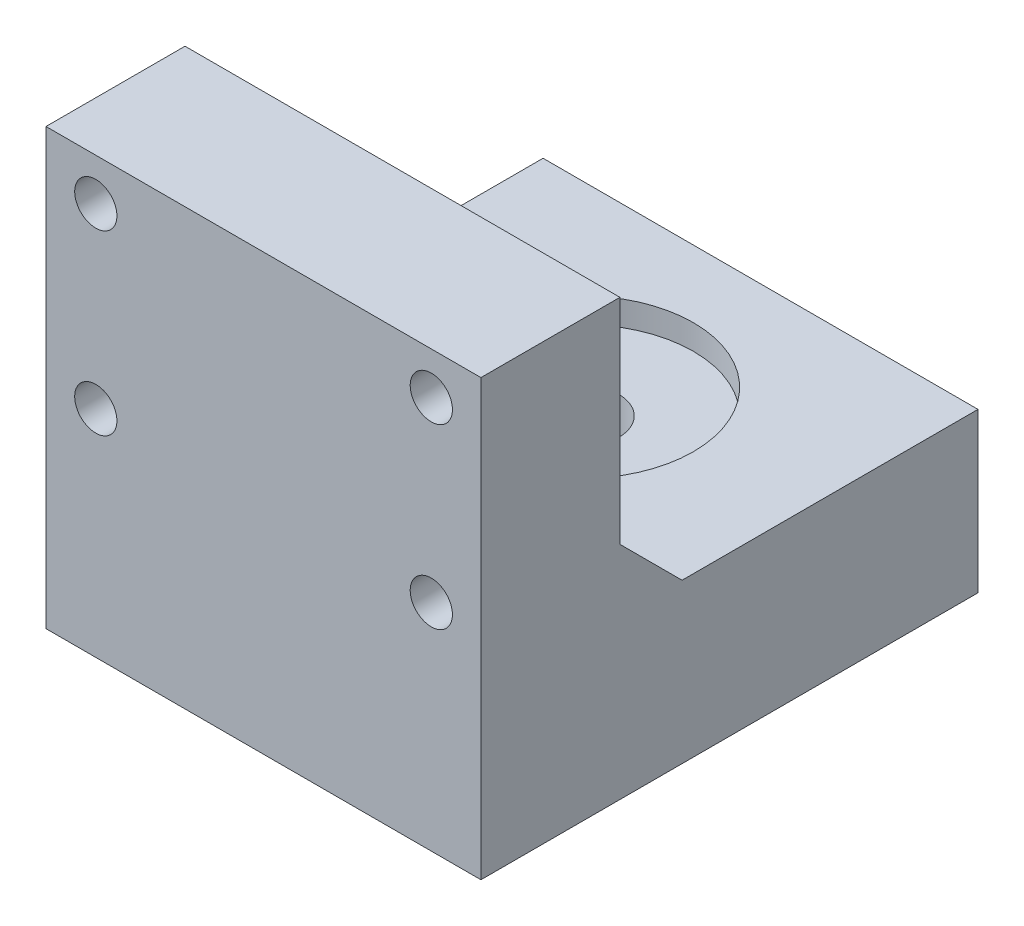
ISO-10303-21;
HEADER;
FILE_DESCRIPTION(('STEP AP214'),'2;1');
FILE_NAME('part.step','',(''),(''),'','','');
FILE_SCHEMA(('AUTOMOTIVE_DESIGN { 1 0 10303 214 1 1 1 1 }'));
ENDSEC;
DATA;
#1=APPLICATION_CONTEXT('core data for automotive mechanical design processes');
#2=APPLICATION_PROTOCOL_DEFINITION('international standard','automotive_design',2000,#1);
#3=PRODUCT_CONTEXT('',#1,'mechanical');
#4=PRODUCT('Part','Part','',(#3));
#5=PRODUCT_RELATED_PRODUCT_CATEGORY('part','',(#4));
#6=PRODUCT_DEFINITION_FORMATION('','',#4);
#7=PRODUCT_DEFINITION_CONTEXT('part definition',#1,'design');
#8=PRODUCT_DEFINITION('design','',#6,#7);
#9=PRODUCT_DEFINITION_SHAPE('','',#8);
#10=(LENGTH_UNIT() NAMED_UNIT(*) SI_UNIT(.MILLI.,.METRE.));
#11=(NAMED_UNIT(*) PLANE_ANGLE_UNIT() SI_UNIT($,.RADIAN.));
#12=(NAMED_UNIT(*) SI_UNIT($,.STERADIAN.) SOLID_ANGLE_UNIT());
#13=UNCERTAINTY_MEASURE_WITH_UNIT(LENGTH_MEASURE(1.E-05),#10,'distance_accuracy_value','');
#14=(GEOMETRIC_REPRESENTATION_CONTEXT(3) GLOBAL_UNCERTAINTY_ASSIGNED_CONTEXT((#13)) GLOBAL_UNIT_ASSIGNED_CONTEXT((#10,
#11,#12)) REPRESENTATION_CONTEXT('',''));
#15=CARTESIAN_POINT('',(0.,0.,0.));
#16=DIRECTION('',(0.,0.,1.));
#17=DIRECTION('',(1.,0.,0.));
#18=AXIS2_PLACEMENT_3D('',#15,#16,#17);
#19=CARTESIAN_POINT('',(17.5,0.,-25.5934447104071));
#20=DIRECTION('',(0.,1.,0.));
#21=DIRECTION('',(0.,0.,1.));
#22=AXIS2_PLACEMENT_3D('',#19,#20,#21);
#23=CYLINDRICAL_SURFACE('',#22,3.0015);
#24=CARTESIAN_POINT('',(17.5,0.,-25.5934447104071));
#25=DIRECTION('',(0.,1.,0.));
#26=DIRECTION('',(0.,0.,1.));
#27=AXIS2_PLACEMENT_3D('',#24,#25,#26);
#28=CIRCLE('',#27,3.0015);
#29=CARTESIAN_POINT('',(17.5,0.,-22.5919447104071));
#30=VERTEX_POINT('',#29);
#31=EDGE_CURVE('E168',#30,#30,#28,.T.);
#32=ORIENTED_EDGE('',*,*,#31,.F.);
#33=EDGE_LOOP('',(#32));
#34=FACE_BOUND('',#33,.T.);
#35=CARTESIAN_POINT('',(17.5,10.7850164809302,-25.5934447104071));
#36=DIRECTION('',(0.,1.,0.));
#37=DIRECTION('',(0.,0.,1.));
#38=AXIS2_PLACEMENT_3D('',#35,#36,#37);
#39=CIRCLE('',#38,3.0015);
#40=CARTESIAN_POINT('',(17.5,10.7850164809302,-22.5919447104071));
#41=VERTEX_POINT('',#40);
#42=EDGE_CURVE('E165',#41,#41,#39,.F.);
#43=ORIENTED_EDGE('',*,*,#42,.F.);
#44=EDGE_LOOP('',(#43));
#45=FACE_BOUND('',#44,.T.);
#46=ADVANCED_FACE('F51',(#34,#45),#23,.F.);
#47=CARTESIAN_POINT('',(35.,35.,-1.04584836647184E-13));
#48=DIRECTION('',(0.,-1.,0.));
#49=DIRECTION('',(0.,0.,-1.));
#50=AXIS2_PLACEMENT_3D('',#47,#48,#49);
#51=PLANE('',#50);
#52=DIRECTION('',(0.,0.,1.));
#53=VECTOR('',#52,1.);
#54=CARTESIAN_POINT('',(0.,35.,-1.04584836647184E-13));
#55=LINE('',#54,#53);
#56=CARTESIAN_POINT('',(0.,35.,-11.1868894208141));
#57=VERTEX_POINT('',#56);
#58=CARTESIAN_POINT('',(0.,35.,-1.04584836647184E-13));
#59=VERTEX_POINT('',#58);
#60=EDGE_CURVE('E151',#57,#59,#55,.T.);
#61=ORIENTED_EDGE('',*,*,#60,.T.);
#62=DIRECTION('',(-1.,0.,0.));
#63=VECTOR('',#62,1.);
#64=CARTESIAN_POINT('',(35.,35.,-1.04584836647184E-13));
#65=LINE('',#64,#63);
#66=CARTESIAN_POINT('',(35.,35.,-1.04584836647184E-13));
#67=VERTEX_POINT('',#66);
#68=EDGE_CURVE('E129',#67,#59,#65,.T.);
#69=ORIENTED_EDGE('',*,*,#68,.F.);
#70=DIRECTION('',(0.,0.,1.));
#71=VECTOR('',#70,1.);
#72=CARTESIAN_POINT('',(35.,35.,-1.04584836647184E-13));
#73=LINE('',#72,#71);
#74=CARTESIAN_POINT('',(35.,35.,-11.1868894208141));
#75=VERTEX_POINT('',#74);
#76=EDGE_CURVE('E137',#75,#67,#73,.T.);
#77=ORIENTED_EDGE('',*,*,#76,.F.);
#78=DIRECTION('',(-1.,0.,0.));
#79=VECTOR('',#78,1.);
#80=CARTESIAN_POINT('',(35.,35.,-11.1868894208141));
#81=LINE('',#80,#79);
#82=EDGE_CURVE('E212',#75,#57,#81,.T.);
#83=ORIENTED_EDGE('',*,*,#82,.T.);
#84=EDGE_LOOP('',(#61,#69,#77,#83));
#85=FACE_BOUND('',#84,.T.);
#86=ADVANCED_FACE('F149',(#85),#51,.F.);
#87=CARTESIAN_POINT('',(35.,35.,-1.04584836647184E-13));
#88=DIRECTION('',(0.,0.,-1.));
#89=DIRECTION('',(0.,1.,0.));
#90=AXIS2_PLACEMENT_3D('',#87,#88,#89);
#91=PLANE('',#90);
#92=CARTESIAN_POINT('',(4.00681868991724,31.6165014780038,0.));
#93=DIRECTION('',(0.,0.,-1.));
#94=DIRECTION('',(-1.,0.,0.));
#95=AXIS2_PLACEMENT_3D('',#92,#93,#94);
#96=CIRCLE('',#95,1.7);
#97=CARTESIAN_POINT('',(2.30681868991724,31.6165014780038,0.));
#98=VERTEX_POINT('',#97);
#99=EDGE_CURVE('E327',#98,#98,#96,.T.);
#100=ORIENTED_EDGE('',*,*,#99,.T.);
#101=EDGE_LOOP('',(#100));
#102=FACE_BOUND('',#101,.T.);
#103=CARTESIAN_POINT('',(4.00681868991724,17.332786674142,0.));
#104=DIRECTION('',(0.,0.,-1.));
#105=DIRECTION('',(-1.,0.,0.));
#106=AXIS2_PLACEMENT_3D('',#103,#104,#105);
#107=CIRCLE('',#106,1.7);
#108=CARTESIAN_POINT('',(2.30681868991724,17.332786674142,0.));
#109=VERTEX_POINT('',#108);
#110=EDGE_CURVE('E315',#109,#109,#107,.T.);
#111=ORIENTED_EDGE('',*,*,#110,.T.);
#112=EDGE_LOOP('',(#111));
#113=FACE_BOUND('',#112,.T.);
#114=CARTESIAN_POINT('',(31.0068186899172,17.332786674142,0.));
#115=DIRECTION('',(0.,0.,-1.));
#116=DIRECTION('',(-1.,0.,0.));
#117=AXIS2_PLACEMENT_3D('',#114,#115,#116);
#118=CIRCLE('',#117,1.7);
#119=CARTESIAN_POINT('',(29.3068186899172,17.332786674142,0.));
#120=VERTEX_POINT('',#119);
#121=EDGE_CURVE('E303',#120,#120,#118,.T.);
#122=ORIENTED_EDGE('',*,*,#121,.T.);
#123=EDGE_LOOP('',(#122));
#124=FACE_BOUND('',#123,.T.);
#125=CARTESIAN_POINT('',(31.0068186899172,31.6165014780038,0.));
#126=DIRECTION('',(0.,0.,-1.));
#127=DIRECTION('',(-1.,0.,0.));
#128=AXIS2_PLACEMENT_3D('',#125,#126,#127);
#129=CIRCLE('',#128,1.7);
#130=CARTESIAN_POINT('',(29.3068186899172,31.6165014780038,0.));
#131=VERTEX_POINT('',#130);
#132=EDGE_CURVE('E285',#131,#131,#129,.T.);
#133=ORIENTED_EDGE('',*,*,#132,.T.);
#134=EDGE_LOOP('',(#133));
#135=FACE_BOUND('',#134,.T.);
#136=DIRECTION('',(0.,-1.,0.));
#137=VECTOR('',#136,1.);
#138=CARTESIAN_POINT('',(0.,35.,-1.04584836647184E-13));
#139=LINE('',#138,#137);
#140=CARTESIAN_POINT('',(0.,0.,0.));
#141=VERTEX_POINT('',#140);
#142=EDGE_CURVE('E258',#59,#141,#139,.T.);
#143=ORIENTED_EDGE('',*,*,#142,.T.);
#144=DIRECTION('',(-1.,0.,0.));
#145=VECTOR('',#144,1.);
#146=CARTESIAN_POINT('',(35.,0.,0.));
#147=LINE('',#146,#145);
#148=CARTESIAN_POINT('',(35.,0.,0.));
#149=VERTEX_POINT('',#148);
#150=EDGE_CURVE('E132',#149,#141,#147,.T.);
#151=ORIENTED_EDGE('',*,*,#150,.F.);
#152=DIRECTION('',(0.,-1.,0.));
#153=VECTOR('',#152,1.);
#154=CARTESIAN_POINT('',(35.,35.,-1.04584836647184E-13));
#155=LINE('',#154,#153);
#156=EDGE_CURVE('E125',#67,#149,#155,.T.);
#157=ORIENTED_EDGE('',*,*,#156,.F.);
#158=ORIENTED_EDGE('',*,*,#68,.T.);
#159=EDGE_LOOP('',(#143,#151,#157,#158));
#160=FACE_BOUND('',#159,.T.);
#161=ADVANCED_FACE('F127',(#102,#113,#124,#135,#160),#91,.F.);
#162=CARTESIAN_POINT('',(35.,0.,0.));
#163=DIRECTION('',(0.,1.,0.));
#164=DIRECTION('',(0.,0.,1.));
#165=AXIS2_PLACEMENT_3D('',#162,#163,#164);
#166=PLANE('',#165);
#167=ORIENTED_EDGE('',*,*,#31,.T.);
#168=EDGE_LOOP('',(#167));
#169=FACE_BOUND('',#168,.T.);
#170=DIRECTION('',(0.,0.,-1.));
#171=VECTOR('',#170,1.);
#172=CARTESIAN_POINT('',(0.,0.,0.));
#173=LINE('',#172,#171);
#174=CARTESIAN_POINT('',(0.,0.,-40.));
#175=VERTEX_POINT('',#174);
#176=EDGE_CURVE('E253',#141,#175,#173,.T.);
#177=ORIENTED_EDGE('',*,*,#176,.T.);
#178=DIRECTION('',(-1.,0.,0.));
#179=VECTOR('',#178,1.);
#180=CARTESIAN_POINT('',(35.,0.,-40.));
#181=LINE('',#180,#179);
#182=CARTESIAN_POINT('',(35.,0.,-40.));
#183=VERTEX_POINT('',#182);
#184=EDGE_CURVE('E161',#183,#175,#181,.T.);
#185=ORIENTED_EDGE('',*,*,#184,.F.);
#186=DIRECTION('',(0.,0.,-1.));
#187=VECTOR('',#186,1.);
#188=CARTESIAN_POINT('',(35.,0.,0.));
#189=LINE('',#188,#187);
#190=EDGE_CURVE('E136',#149,#183,#189,.T.);
#191=ORIENTED_EDGE('',*,*,#190,.F.);
#192=ORIENTED_EDGE('',*,*,#150,.T.);
#193=EDGE_LOOP('',(#177,#185,#191,#192));
#194=FACE_BOUND('',#193,.T.);
#195=ADVANCED_FACE('F394',(#169,#194),#166,.F.);
#196=CARTESIAN_POINT('',(35.,12.7850164809302,-40.));
#197=DIRECTION('',(0.,0.,1.));
#198=DIRECTION('',(1.,0.,0.));
#199=AXIS2_PLACEMENT_3D('',#196,#197,#198);
#200=PLANE('',#199);
#201=DIRECTION('',(0.,1.,0.));
#202=VECTOR('',#201,1.);
#203=CARTESIAN_POINT('',(0.,12.7850164809302,-40.));
#204=LINE('',#203,#202);
#205=CARTESIAN_POINT('',(0.,12.7850164809302,-40.));
#206=VERTEX_POINT('',#205);
#207=EDGE_CURVE('E248',#175,#206,#204,.T.);
#208=ORIENTED_EDGE('',*,*,#207,.T.);
#209=DIRECTION('',(-1.,0.,0.));
#210=VECTOR('',#209,1.);
#211=CARTESIAN_POINT('',(35.,12.7850164809302,-40.));
#212=LINE('',#211,#210);
#213=CARTESIAN_POINT('',(35.,12.7850164809302,-40.));
#214=VERTEX_POINT('',#213);
#215=EDGE_CURVE('E207',#214,#206,#212,.T.);
#216=ORIENTED_EDGE('',*,*,#215,.F.);
#217=DIRECTION('',(0.,1.,0.));
#218=VECTOR('',#217,1.);
#219=CARTESIAN_POINT('',(35.,12.7850164809302,-40.));
#220=LINE('',#219,#218);
#221=EDGE_CURVE('E226',#183,#214,#220,.T.);
#222=ORIENTED_EDGE('',*,*,#221,.F.);
#223=ORIENTED_EDGE('',*,*,#184,.T.);
#224=EDGE_LOOP('',(#208,#216,#222,#223));
#225=FACE_BOUND('',#224,.T.);
#226=ADVANCED_FACE('F390',(#225),#200,.F.);
#227=CARTESIAN_POINT('',(35.,12.7850164809302,-11.1868894208141));
#228=DIRECTION('',(0.,-1.,0.));
#229=DIRECTION('',(0.,0.,-1.));
#230=AXIS2_PLACEMENT_3D('',#227,#228,#229);
#231=PLANE('',#230);
#232=CARTESIAN_POINT('',(17.5,12.7850164809302,-25.5934447104071));
#233=DIRECTION('',(0.,1.,0.));
#234=DIRECTION('',(0.,0.,1.));
#235=AXIS2_PLACEMENT_3D('',#232,#233,#234);
#236=CIRCLE('',#235,9.);
#237=CARTESIAN_POINT('',(17.5,12.7850164809302,-16.5934447104071));
#238=VERTEX_POINT('',#237);
#239=EDGE_CURVE('E279',#238,#238,#236,.T.);
#240=ORIENTED_EDGE('',*,*,#239,.F.);
#241=EDGE_LOOP('',(#240));
#242=FACE_BOUND('',#241,.T.);
#243=DIRECTION('',(0.,0.,1.));
#244=VECTOR('',#243,1.);
#245=CARTESIAN_POINT('',(0.,12.7850164809302,-11.1868894208141));
#246=LINE('',#245,#244);
#247=CARTESIAN_POINT('',(0.,12.7850164809302,-16.1868894208141));
#248=VERTEX_POINT('',#247);
#249=EDGE_CURVE('E243',#206,#248,#246,.T.);
#250=ORIENTED_EDGE('',*,*,#249,.T.);
#251=DIRECTION('',(1.,0.,0.));
#252=VECTOR('',#251,1.);
#253=CARTESIAN_POINT('',(35.,12.7850164809302,-16.1868894208141));
#254=LINE('',#253,#252);
#255=CARTESIAN_POINT('',(35.,12.7850164809302,-16.1868894208141));
#256=VERTEX_POINT('',#255);
#257=EDGE_CURVE('E68',#248,#256,#254,.T.);
#258=ORIENTED_EDGE('',*,*,#257,.T.);
#259=DIRECTION('',(0.,0.,1.));
#260=VECTOR('',#259,1.);
#261=CARTESIAN_POINT('',(35.,12.7850164809302,-11.1868894208141));
#262=LINE('',#261,#260);
#263=EDGE_CURVE('E221',#214,#256,#262,.T.);
#264=ORIENTED_EDGE('',*,*,#263,.F.);
#265=ORIENTED_EDGE('',*,*,#215,.T.);
#266=EDGE_LOOP('',(#250,#258,#264,#265));
#267=FACE_BOUND('',#266,.T.);
#268=ADVANCED_FACE('F348',(#242,#267),#231,.F.);
#269=CARTESIAN_POINT('',(35.,35.,-11.1868894208141));
#270=DIRECTION('',(0.,0.,1.));
#271=DIRECTION('',(1.,0.,0.));
#272=AXIS2_PLACEMENT_3D('',#269,#270,#271);
#273=PLANE('',#272);
#274=CARTESIAN_POINT('',(4.00681868991724,31.6165014780038,-11.1868894208141));
#275=DIRECTION('',(0.,0.,-1.));
#276=DIRECTION('',(-1.,0.,0.));
#277=AXIS2_PLACEMENT_3D('',#274,#275,#276);
#278=CIRCLE('',#277,1.7);
#279=CARTESIAN_POINT('',(2.30681868991724,31.6165014780038,-11.1868894208141));
#280=VERTEX_POINT('',#279);
#281=EDGE_CURVE('E321',#280,#280,#278,.T.);
#282=ORIENTED_EDGE('',*,*,#281,.F.);
#283=EDGE_LOOP('',(#282));
#284=FACE_BOUND('',#283,.T.);
#285=DIRECTION('',(0.,1.,0.));
#286=VECTOR('',#285,1.);
#287=CARTESIAN_POINT('',(35.,35.,-11.1868894208141));
#288=LINE('',#287,#286);
#289=CARTESIAN_POINT('',(35.,17.7850164809303,-11.1868894208141));
#290=VERTEX_POINT('',#289);
#291=EDGE_CURVE('E142',#290,#75,#288,.T.);
#292=ORIENTED_EDGE('',*,*,#291,.F.);
#293=DIRECTION('',(-1.,0.,0.));
#294=VECTOR('',#293,1.);
#295=CARTESIAN_POINT('',(0.,17.7850164809303,-11.1868894208141));
#296=LINE('',#295,#294);
#297=CARTESIAN_POINT('',(32.6455646134369,17.7850164809303,-11.1868894208141));
#298=VERTEX_POINT('',#297);
#299=EDGE_CURVE('E173',#290,#298,#296,.T.);
#300=ORIENTED_EDGE('',*,*,#299,.T.);
#301=CARTESIAN_POINT('',(31.0068186899172,17.332786674142,-11.1868894208141));
#302=DIRECTION('',(0.,0.,-1.));
#303=DIRECTION('',(-1.,0.,0.));
#304=AXIS2_PLACEMENT_3D('',#301,#302,#303);
#305=CIRCLE('',#304,1.7);
#306=CARTESIAN_POINT('',(29.3680727663976,17.7850164809303,-11.1868894208141));
#307=VERTEX_POINT('',#306);
#308=EDGE_CURVE('E297',#307,#298,#305,.T.);
#309=ORIENTED_EDGE('',*,*,#308,.F.);
#310=DIRECTION('',(-1.,0.,0.));
#311=VECTOR('',#310,1.);
#312=CARTESIAN_POINT('',(0.,17.7850164809303,-11.1868894208141));
#313=LINE('',#312,#311);
#314=CARTESIAN_POINT('',(5.64556461343688,17.7850164809303,-11.1868894208141));
#315=VERTEX_POINT('',#314);
#316=EDGE_CURVE('E159',#307,#315,#313,.T.);
#317=ORIENTED_EDGE('',*,*,#316,.T.);
#318=CARTESIAN_POINT('',(4.00681868991724,17.332786674142,-11.1868894208141));
#319=DIRECTION('',(0.,0.,-1.));
#320=DIRECTION('',(-1.,0.,0.));
#321=AXIS2_PLACEMENT_3D('',#318,#319,#320);
#322=CIRCLE('',#321,1.7);
#323=CARTESIAN_POINT('',(2.36807276639759,17.7850164809303,-11.1868894208141));
#324=VERTEX_POINT('',#323);
#325=EDGE_CURVE('E309',#324,#315,#322,.T.);
#326=ORIENTED_EDGE('',*,*,#325,.F.);
#327=DIRECTION('',(-1.,0.,0.));
#328=VECTOR('',#327,1.);
#329=CARTESIAN_POINT('',(0.,17.7850164809303,-11.1868894208141));
#330=LINE('',#329,#328);
#331=CARTESIAN_POINT('',(0.,17.7850164809303,-11.1868894208141));
#332=VERTEX_POINT('',#331);
#333=EDGE_CURVE('E153',#324,#332,#330,.T.);
#334=ORIENTED_EDGE('',*,*,#333,.T.);
#335=DIRECTION('',(0.,1.,0.));
#336=VECTOR('',#335,1.);
#337=CARTESIAN_POINT('',(0.,35.,-11.1868894208141));
#338=LINE('',#337,#336);
#339=EDGE_CURVE('E147',#332,#57,#338,.T.);
#340=ORIENTED_EDGE('',*,*,#339,.T.);
#341=ORIENTED_EDGE('',*,*,#82,.F.);
#342=EDGE_LOOP('',(#292,#300,#309,#317,#326,#334,#340,#341));
#343=FACE_BOUND('',#342,.T.);
#344=CARTESIAN_POINT('',(31.0068186899172,31.6165014780038,-11.1868894208141));
#345=DIRECTION('',(0.,0.,-1.));
#346=DIRECTION('',(-1.,0.,0.));
#347=AXIS2_PLACEMENT_3D('',#344,#345,#346);
#348=CIRCLE('',#347,1.7);
#349=CARTESIAN_POINT('',(29.3068186899172,31.6165014780038,-11.1868894208141));
#350=VERTEX_POINT('',#349);
#351=EDGE_CURVE('E291',#350,#350,#348,.T.);
#352=ORIENTED_EDGE('',*,*,#351,.F.);
#353=EDGE_LOOP('',(#352));
#354=FACE_BOUND('',#353,.T.);
#355=ADVANCED_FACE('F345',(#284,#343,#354),#273,.F.);
#356=CARTESIAN_POINT('',(35.,0.,0.));
#357=DIRECTION('',(-1.,0.,0.));
#358=DIRECTION('',(0.,0.,1.));
#359=AXIS2_PLACEMENT_3D('',#356,#357,#358);
#360=PLANE('',#359);
#361=ORIENTED_EDGE('',*,*,#76,.T.);
#362=ORIENTED_EDGE('',*,*,#156,.T.);
#363=ORIENTED_EDGE('',*,*,#190,.T.);
#364=ORIENTED_EDGE('',*,*,#221,.T.);
#365=ORIENTED_EDGE('',*,*,#263,.T.);
#366=DIRECTION('',(0.,-0.70710678118655,-0.707106781186545));
#367=VECTOR('',#366,1.);
#368=CARTESIAN_POINT('',(35.,14.4859529508721,-14.4859529508722));
#369=LINE('',#368,#367);
#370=EDGE_CURVE('E11',#256,#290,#369,.F.);
#371=ORIENTED_EDGE('',*,*,#370,.T.);
#372=ORIENTED_EDGE('',*,*,#291,.T.);
#373=EDGE_LOOP('',(#361,#362,#363,#364,#365,#371,#372));
#374=FACE_BOUND('',#373,.T.);
#375=ADVANCED_FACE('F140',(#374),#360,.F.);
#376=CARTESIAN_POINT('',(0.,0.,0.));
#377=DIRECTION('',(-1.,0.,0.));
#378=DIRECTION('',(0.,0.,1.));
#379=AXIS2_PLACEMENT_3D('',#376,#377,#378);
#380=PLANE('',#379);
#381=ORIENTED_EDGE('',*,*,#60,.F.);
#382=ORIENTED_EDGE('',*,*,#339,.F.);
#383=DIRECTION('',(0.,0.70710678118655,0.707106781186545));
#384=VECTOR('',#383,1.);
#385=CARTESIAN_POINT('',(0.,17.7850164809303,-11.1868894208141));
#386=LINE('',#385,#384);
#387=EDGE_CURVE('E61',#332,#248,#386,.F.);
#388=ORIENTED_EDGE('',*,*,#387,.T.);
#389=ORIENTED_EDGE('',*,*,#249,.F.);
#390=ORIENTED_EDGE('',*,*,#207,.F.);
#391=ORIENTED_EDGE('',*,*,#176,.F.);
#392=ORIENTED_EDGE('',*,*,#142,.F.);
#393=EDGE_LOOP('',(#381,#382,#388,#389,#390,#391,#392));
#394=FACE_BOUND('',#393,.T.);
#395=ADVANCED_FACE('F385',(#394),#380,.T.);
#396=CARTESIAN_POINT('',(17.5,10.7850164809302,-25.5934447104071));
#397=DIRECTION('',(0.,1.,0.));
#398=DIRECTION('',(0.,0.,1.));
#399=AXIS2_PLACEMENT_3D('',#396,#397,#398);
#400=PLANE('',#399);
#401=CARTESIAN_POINT('',(17.5,10.7850164809302,-25.5934447104071));
#402=DIRECTION('',(0.,1.,0.));
#403=DIRECTION('',(0.,0.,1.));
#404=AXIS2_PLACEMENT_3D('',#401,#402,#403);
#405=CIRCLE('',#404,9.);
#406=CARTESIAN_POINT('',(17.5,10.7850164809302,-16.5934447104071));
#407=VERTEX_POINT('',#406);
#408=EDGE_CURVE('E169',#407,#407,#405,.T.);
#409=ORIENTED_EDGE('',*,*,#408,.T.);
#410=EDGE_LOOP('',(#409));
#411=FACE_BOUND('',#410,.T.);
#412=ORIENTED_EDGE('',*,*,#42,.T.);
#413=EDGE_LOOP('',(#412));
#414=FACE_BOUND('',#413,.T.);
#415=ADVANCED_FACE('F367',(#411,#414),#400,.T.);
#416=CARTESIAN_POINT('',(17.5,10.7850164809302,-25.5934447104071));
#417=DIRECTION('',(0.,1.,0.));
#418=DIRECTION('',(0.,0.,1.));
#419=AXIS2_PLACEMENT_3D('',#416,#417,#418);
#420=CYLINDRICAL_SURFACE('',#419,9.);
#421=ORIENTED_EDGE('',*,*,#408,.F.);
#422=EDGE_LOOP('',(#421));
#423=FACE_BOUND('',#422,.T.);
#424=ORIENTED_EDGE('',*,*,#239,.T.);
#425=EDGE_LOOP('',(#424));
#426=FACE_BOUND('',#425,.T.);
#427=ADVANCED_FACE('F357',(#423,#426),#420,.F.);
#428=CARTESIAN_POINT('',(31.0068186899172,31.6165014780038,0.));
#429=DIRECTION('',(0.,0.,-1.));
#430=DIRECTION('',(-1.,0.,0.));
#431=AXIS2_PLACEMENT_3D('',#428,#429,#430);
#432=CYLINDRICAL_SURFACE('',#431,1.7);
#433=ORIENTED_EDGE('',*,*,#132,.F.);
#434=EDGE_LOOP('',(#433));
#435=FACE_BOUND('',#434,.T.);
#436=ORIENTED_EDGE('',*,*,#351,.T.);
#437=EDGE_LOOP('',(#436));
#438=FACE_BOUND('',#437,.T.);
#439=ADVANCED_FACE('F354',(#435,#438),#432,.F.);
#440=CARTESIAN_POINT('',(31.0068186899172,17.332786674142,0.));
#441=DIRECTION('',(0.,0.,-1.));
#442=DIRECTION('',(-1.,0.,0.));
#443=AXIS2_PLACEMENT_3D('',#440,#441,#442);
#444=CYLINDRICAL_SURFACE('',#443,1.7);
#445=ORIENTED_EDGE('',*,*,#121,.F.);
#446=EDGE_LOOP('',(#445));
#447=FACE_BOUND('',#446,.T.);
#448=ORIENTED_EDGE('',*,*,#308,.T.);
#449=CARTESIAN_POINT('',(31.0068186899172,17.332786674142,-11.6391192276023));
#450=DIRECTION('',(0.,0.707106781186545,-0.707106781186551));
#451=DIRECTION('',(0.,-0.70710678118655,-0.707106781186545));
#452=AXIS2_PLACEMENT_3D('',#449,#450,#451);
#453=ELLIPSE('',#452,2.40416305603425,1.7);
#454=EDGE_CURVE('E179',#298,#307,#453,.T.);
#455=ORIENTED_EDGE('',*,*,#454,.T.);
#456=EDGE_LOOP('',(#448,#455));
#457=FACE_BOUND('',#456,.T.);
#458=ADVANCED_FACE('F356',(#447,#457),#444,.F.);
#459=CARTESIAN_POINT('',(4.00681868991724,17.332786674142,0.));
#460=DIRECTION('',(0.,0.,-1.));
#461=DIRECTION('',(-1.,0.,0.));
#462=AXIS2_PLACEMENT_3D('',#459,#460,#461);
#463=CYLINDRICAL_SURFACE('',#462,1.7);
#464=ORIENTED_EDGE('',*,*,#110,.F.);
#465=EDGE_LOOP('',(#464));
#466=FACE_BOUND('',#465,.T.);
#467=ORIENTED_EDGE('',*,*,#325,.T.);
#468=CARTESIAN_POINT('',(4.00681868991724,17.332786674142,-11.6391192276023));
#469=DIRECTION('',(0.,0.707106781186545,-0.707106781186551));
#470=DIRECTION('',(0.,-0.70710678118655,-0.707106781186545));
#471=AXIS2_PLACEMENT_3D('',#468,#469,#470);
#472=ELLIPSE('',#471,2.40416305603425,1.7);
#473=EDGE_CURVE('E182',#315,#324,#472,.T.);
#474=ORIENTED_EDGE('',*,*,#473,.T.);
#475=EDGE_LOOP('',(#467,#474));
#476=FACE_BOUND('',#475,.T.);
#477=ADVANCED_FACE('F341',(#466,#476),#463,.F.);
#478=CARTESIAN_POINT('',(4.00681868991724,31.6165014780038,0.));
#479=DIRECTION('',(0.,0.,-1.));
#480=DIRECTION('',(-1.,0.,0.));
#481=AXIS2_PLACEMENT_3D('',#478,#479,#480);
#482=CYLINDRICAL_SURFACE('',#481,1.7);
#483=ORIENTED_EDGE('',*,*,#99,.F.);
#484=EDGE_LOOP('',(#483));
#485=FACE_BOUND('',#484,.T.);
#486=ORIENTED_EDGE('',*,*,#281,.T.);
#487=EDGE_LOOP('',(#486));
#488=FACE_BOUND('',#487,.T.);
#489=ADVANCED_FACE('F338',(#485,#488),#482,.F.);
#490=CARTESIAN_POINT('',(35.,17.7850164809303,-11.1868894208141));
#491=DIRECTION('',(0.,0.707106781186545,-0.707106781186551));
#492=DIRECTION('',(1.,0.,0.));
#493=AXIS2_PLACEMENT_3D('',#490,#491,#492);
#494=PLANE('',#493);
#495=ORIENTED_EDGE('',*,*,#370,.F.);
#496=ORIENTED_EDGE('',*,*,#257,.F.);
#497=ORIENTED_EDGE('',*,*,#387,.F.);
#498=ORIENTED_EDGE('',*,*,#333,.F.);
#499=ORIENTED_EDGE('',*,*,#473,.F.);
#500=ORIENTED_EDGE('',*,*,#316,.F.);
#501=ORIENTED_EDGE('',*,*,#454,.F.);
#502=ORIENTED_EDGE('',*,*,#299,.F.);
#503=EDGE_LOOP('',(#495,#496,#497,#498,#499,#500,#501,#502));
#504=FACE_BOUND('',#503,.T.);
#505=ADVANCED_FACE('F54',(#504),#494,.T.);
#506=CLOSED_SHELL('',(#46,#86,#161,#195,#226,#268,#355,#375,#395,#415,#427,#439,#458,#477,#489,#505));
#507=MANIFOLD_SOLID_BREP('B2',#506);
#508=ADVANCED_BREP_SHAPE_REPRESENTATION('',(#18,#507),#14);
#509=SHAPE_DEFINITION_REPRESENTATION(#9,#508);
ENDSEC;
END-ISO-10303-21;
